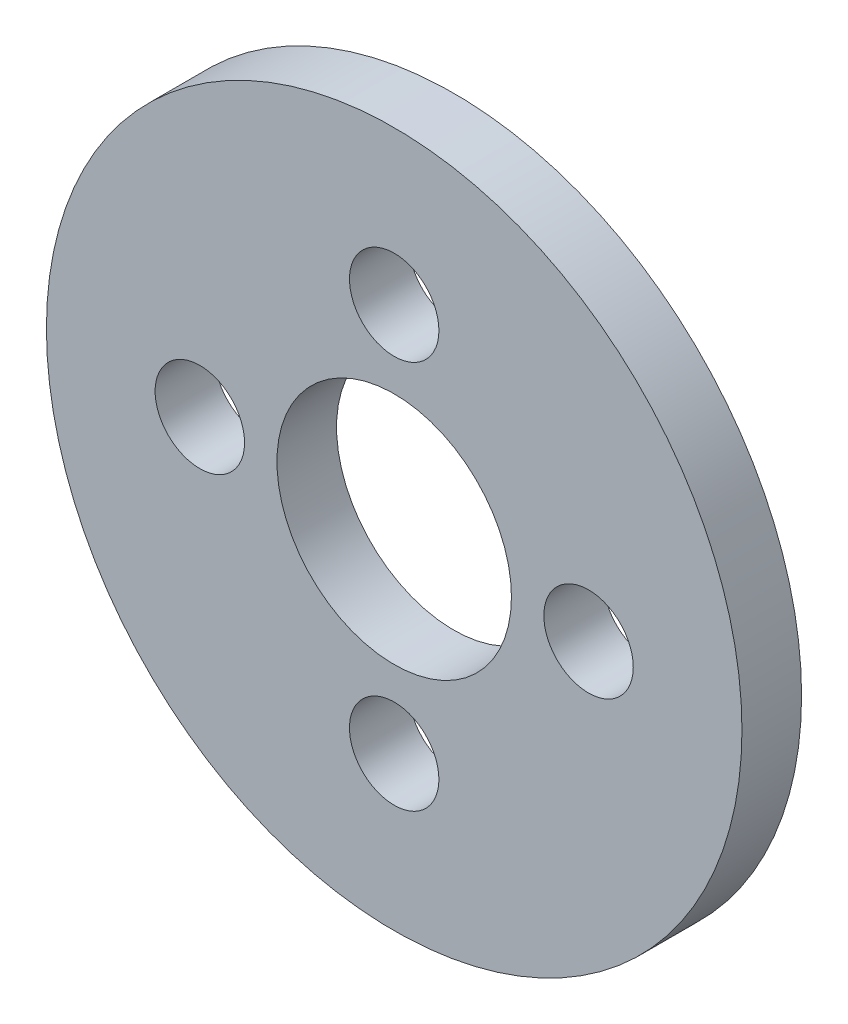
ISO-10303-21;
HEADER;
FILE_DESCRIPTION(('STEP AP214'),'2;1');
FILE_NAME('part.step','',(''),(''),'','','');
FILE_SCHEMA(('AUTOMOTIVE_DESIGN { 1 0 10303 214 1 1 1 1 }'));
ENDSEC;
DATA;
#1=APPLICATION_CONTEXT('core data for automotive mechanical design processes');
#2=APPLICATION_PROTOCOL_DEFINITION('international standard','automotive_design',2000,#1);
#3=PRODUCT_CONTEXT('',#1,'mechanical');
#4=PRODUCT('Part','Part','',(#3));
#5=PRODUCT_RELATED_PRODUCT_CATEGORY('part','',(#4));
#6=PRODUCT_DEFINITION_FORMATION('','',#4);
#7=PRODUCT_DEFINITION_CONTEXT('part definition',#1,'design');
#8=PRODUCT_DEFINITION('design','',#6,#7);
#9=PRODUCT_DEFINITION_SHAPE('','',#8);
#10=(LENGTH_UNIT() NAMED_UNIT(*) SI_UNIT(.MILLI.,.METRE.));
#11=(NAMED_UNIT(*) PLANE_ANGLE_UNIT() SI_UNIT($,.RADIAN.));
#12=(NAMED_UNIT(*) SI_UNIT($,.STERADIAN.) SOLID_ANGLE_UNIT());
#13=UNCERTAINTY_MEASURE_WITH_UNIT(LENGTH_MEASURE(1.E-05),#10,'distance_accuracy_value','');
#14=(GEOMETRIC_REPRESENTATION_CONTEXT(3) GLOBAL_UNCERTAINTY_ASSIGNED_CONTEXT((#13)) GLOBAL_UNIT_ASSIGNED_CONTEXT((#10,
#11,#12)) REPRESENTATION_CONTEXT('',''));
#15=CARTESIAN_POINT('',(0.,0.,0.));
#16=DIRECTION('',(0.,0.,1.));
#17=DIRECTION('',(1.,0.,0.));
#18=AXIS2_PLACEMENT_3D('',#15,#16,#17);
#19=CARTESIAN_POINT('',(0.,0.,3.));
#20=DIRECTION('',(0.,0.,-1.));
#21=DIRECTION('',(-1.,0.,0.));
#22=AXIS2_PLACEMENT_3D('',#19,#20,#21);
#23=CYLINDRICAL_SURFACE('',#22,5.9);
#24=CARTESIAN_POINT('',(0.,0.,3.));
#25=DIRECTION('',(0.,0.,1.));
#26=DIRECTION('',(1.,0.,0.));
#27=AXIS2_PLACEMENT_3D('',#24,#25,#26);
#28=CIRCLE('',#27,5.9);
#29=CARTESIAN_POINT('',(5.9,0.,3.));
#30=VERTEX_POINT('',#29);
#31=EDGE_CURVE('E41',#30,#30,#28,.T.);
#32=ORIENTED_EDGE('',*,*,#31,.T.);
#33=EDGE_LOOP('',(#32));
#34=FACE_BOUND('',#33,.T.);
#35=CARTESIAN_POINT('',(0.,0.,0.));
#36=DIRECTION('',(0.,0.,1.));
#37=DIRECTION('',(1.,0.,0.));
#38=AXIS2_PLACEMENT_3D('',#35,#36,#37);
#39=CIRCLE('',#38,5.9);
#40=CARTESIAN_POINT('',(5.9,0.,0.));
#41=VERTEX_POINT('',#40);
#42=EDGE_CURVE('E48',#41,#41,#39,.T.);
#43=ORIENTED_EDGE('',*,*,#42,.F.);
#44=EDGE_LOOP('',(#43));
#45=FACE_BOUND('',#44,.T.);
#46=ADVANCED_FACE('F34',(#34,#45),#23,.F.);
#47=CARTESIAN_POINT('',(0.,0.,3.));
#48=DIRECTION('',(0.,0.,-1.));
#49=DIRECTION('',(-1.,0.,0.));
#50=AXIS2_PLACEMENT_3D('',#47,#48,#49);
#51=CYLINDRICAL_SURFACE('',#50,17.5);
#52=CARTESIAN_POINT('',(0.,0.,3.));
#53=DIRECTION('',(0.,0.,1.));
#54=DIRECTION('',(1.,0.,0.));
#55=AXIS2_PLACEMENT_3D('',#52,#53,#54);
#56=CIRCLE('',#55,17.5);
#57=CARTESIAN_POINT('',(17.5,0.,3.));
#58=VERTEX_POINT('',#57);
#59=EDGE_CURVE('E10',#58,#58,#56,.T.);
#60=ORIENTED_EDGE('',*,*,#59,.F.);
#61=EDGE_LOOP('',(#60));
#62=FACE_BOUND('',#61,.T.);
#63=CARTESIAN_POINT('',(0.,0.,0.));
#64=DIRECTION('',(0.,0.,1.));
#65=DIRECTION('',(1.,0.,0.));
#66=AXIS2_PLACEMENT_3D('',#63,#64,#65);
#67=CIRCLE('',#66,17.5);
#68=CARTESIAN_POINT('',(17.5,0.,0.));
#69=VERTEX_POINT('',#68);
#70=EDGE_CURVE('E37',#69,#69,#67,.T.);
#71=ORIENTED_EDGE('',*,*,#70,.T.);
#72=EDGE_LOOP('',(#71));
#73=FACE_BOUND('',#72,.T.);
#74=ADVANCED_FACE('F93',(#62,#73),#51,.T.);
#75=CARTESIAN_POINT('',(0.,0.,3.));
#76=DIRECTION('',(0.,0.,1.));
#77=DIRECTION('',(1.,0.,0.));
#78=AXIS2_PLACEMENT_3D('',#75,#76,#77);
#79=PLANE('',#78);
#80=CARTESIAN_POINT('',(-9.78,1.01572700743669E-13,3.));
#81=DIRECTION('',(0.,0.,1.));
#82=DIRECTION('',(1.,0.,0.));
#83=AXIS2_PLACEMENT_3D('',#80,#81,#82);
#84=CIRCLE('',#83,2.25);
#85=CARTESIAN_POINT('',(-7.53,1.01572700743669E-13,3.));
#86=VERTEX_POINT('',#85);
#87=EDGE_CURVE('E74',#86,#86,#84,.T.);
#88=ORIENTED_EDGE('',*,*,#87,.F.);
#89=EDGE_LOOP('',(#88));
#90=FACE_BOUND('',#89,.T.);
#91=CARTESIAN_POINT('',(0.,9.78,3.));
#92=DIRECTION('',(0.,0.,1.));
#93=DIRECTION('',(1.,0.,0.));
#94=AXIS2_PLACEMENT_3D('',#91,#92,#93);
#95=CIRCLE('',#94,2.25);
#96=CARTESIAN_POINT('',(2.25,9.78,3.));
#97=VERTEX_POINT('',#96);
#98=EDGE_CURVE('E68',#97,#97,#95,.T.);
#99=ORIENTED_EDGE('',*,*,#98,.F.);
#100=EDGE_LOOP('',(#99));
#101=FACE_BOUND('',#100,.T.);
#102=CARTESIAN_POINT('',(9.78,-1.72604985859692E-13,3.));
#103=DIRECTION('',(0.,0.,1.));
#104=DIRECTION('',(1.,0.,0.));
#105=AXIS2_PLACEMENT_3D('',#102,#103,#104);
#106=CIRCLE('',#105,2.25);
#107=CARTESIAN_POINT('',(12.03,-1.72604985859692E-13,3.));
#108=VERTEX_POINT('',#107);
#109=EDGE_CURVE('E62',#108,#108,#106,.T.);
#110=ORIENTED_EDGE('',*,*,#109,.F.);
#111=EDGE_LOOP('',(#110));
#112=FACE_BOUND('',#111,.T.);
#113=CARTESIAN_POINT('',(0.,-9.78,3.));
#114=DIRECTION('',(0.,0.,1.));
#115=DIRECTION('',(1.,0.,0.));
#116=AXIS2_PLACEMENT_3D('',#113,#114,#115);
#117=CIRCLE('',#116,2.25);
#118=CARTESIAN_POINT('',(2.25,-9.78,3.));
#119=VERTEX_POINT('',#118);
#120=EDGE_CURVE('E55',#119,#119,#117,.T.);
#121=ORIENTED_EDGE('',*,*,#120,.F.);
#122=EDGE_LOOP('',(#121));
#123=FACE_BOUND('',#122,.T.);
#124=ORIENTED_EDGE('',*,*,#31,.F.);
#125=EDGE_LOOP('',(#124));
#126=FACE_BOUND('',#125,.T.);
#127=ORIENTED_EDGE('',*,*,#59,.T.);
#128=EDGE_LOOP('',(#127));
#129=FACE_BOUND('',#128,.T.);
#130=ADVANCED_FACE('F90',(#90,#101,#112,#123,#126,#129),#79,.T.);
#131=CARTESIAN_POINT('',(0.,0.,0.));
#132=DIRECTION('',(0.,0.,1.));
#133=DIRECTION('',(1.,0.,0.));
#134=AXIS2_PLACEMENT_3D('',#131,#132,#133);
#135=PLANE('',#134);
#136=CARTESIAN_POINT('',(-9.78,1.01572700743669E-13,0.));
#137=DIRECTION('',(0.,0.,1.));
#138=DIRECTION('',(1.,0.,0.));
#139=AXIS2_PLACEMENT_3D('',#136,#137,#138);
#140=CIRCLE('',#139,2.25);
#141=CARTESIAN_POINT('',(-7.53,1.01572700743669E-13,0.));
#142=VERTEX_POINT('',#141);
#143=EDGE_CURVE('E71',#142,#142,#140,.T.);
#144=ORIENTED_EDGE('',*,*,#143,.T.);
#145=EDGE_LOOP('',(#144));
#146=FACE_BOUND('',#145,.T.);
#147=CARTESIAN_POINT('',(0.,9.78,0.));
#148=DIRECTION('',(0.,0.,1.));
#149=DIRECTION('',(1.,0.,0.));
#150=AXIS2_PLACEMENT_3D('',#147,#148,#149);
#151=CIRCLE('',#150,2.25);
#152=CARTESIAN_POINT('',(2.25,9.78,0.));
#153=VERTEX_POINT('',#152);
#154=EDGE_CURVE('E65',#153,#153,#151,.T.);
#155=ORIENTED_EDGE('',*,*,#154,.T.);
#156=EDGE_LOOP('',(#155));
#157=FACE_BOUND('',#156,.T.);
#158=CARTESIAN_POINT('',(9.78,-1.72604985859692E-13,0.));
#159=DIRECTION('',(0.,0.,1.));
#160=DIRECTION('',(1.,0.,0.));
#161=AXIS2_PLACEMENT_3D('',#158,#159,#160);
#162=CIRCLE('',#161,2.25);
#163=CARTESIAN_POINT('',(12.03,-1.72604985859692E-13,0.));
#164=VERTEX_POINT('',#163);
#165=EDGE_CURVE('E60',#164,#164,#162,.T.);
#166=ORIENTED_EDGE('',*,*,#165,.T.);
#167=EDGE_LOOP('',(#166));
#168=FACE_BOUND('',#167,.T.);
#169=CARTESIAN_POINT('',(0.,-9.78,0.));
#170=DIRECTION('',(0.,0.,1.));
#171=DIRECTION('',(1.,0.,0.));
#172=AXIS2_PLACEMENT_3D('',#169,#170,#171);
#173=CIRCLE('',#172,2.25);
#174=CARTESIAN_POINT('',(2.25,-9.78,0.));
#175=VERTEX_POINT('',#174);
#176=EDGE_CURVE('E50',#175,#175,#173,.T.);
#177=ORIENTED_EDGE('',*,*,#176,.T.);
#178=EDGE_LOOP('',(#177));
#179=FACE_BOUND('',#178,.T.);
#180=ORIENTED_EDGE('',*,*,#42,.T.);
#181=EDGE_LOOP('',(#180));
#182=FACE_BOUND('',#181,.T.);
#183=ORIENTED_EDGE('',*,*,#70,.F.);
#184=EDGE_LOOP('',(#183));
#185=FACE_BOUND('',#184,.T.);
#186=ADVANCED_FACE('F80',(#146,#157,#168,#179,#182,#185),#135,.F.);
#187=CARTESIAN_POINT('',(0.,-9.78,0.));
#188=DIRECTION('',(0.,0.,1.));
#189=DIRECTION('',(1.,0.,0.));
#190=AXIS2_PLACEMENT_3D('',#187,#188,#189);
#191=CYLINDRICAL_SURFACE('',#190,2.25);
#192=ORIENTED_EDGE('',*,*,#176,.F.);
#193=EDGE_LOOP('',(#192));
#194=FACE_BOUND('',#193,.T.);
#195=ORIENTED_EDGE('',*,*,#120,.T.);
#196=EDGE_LOOP('',(#195));
#197=FACE_BOUND('',#196,.T.);
#198=ADVANCED_FACE('F114',(#194,#197),#191,.F.);
#199=CARTESIAN_POINT('',(9.78,-1.72604985859692E-13,0.));
#200=DIRECTION('',(0.,0.,1.));
#201=DIRECTION('',(1.,0.,0.));
#202=AXIS2_PLACEMENT_3D('',#199,#200,#201);
#203=CYLINDRICAL_SURFACE('',#202,2.25);
#204=ORIENTED_EDGE('',*,*,#165,.F.);
#205=EDGE_LOOP('',(#204));
#206=FACE_BOUND('',#205,.T.);
#207=ORIENTED_EDGE('',*,*,#109,.T.);
#208=EDGE_LOOP('',(#207));
#209=FACE_BOUND('',#208,.T.);
#210=ADVANCED_FACE('F118',(#206,#209),#203,.F.);
#211=CARTESIAN_POINT('',(0.,9.78,0.));
#212=DIRECTION('',(0.,0.,1.));
#213=DIRECTION('',(1.,0.,0.));
#214=AXIS2_PLACEMENT_3D('',#211,#212,#213);
#215=CYLINDRICAL_SURFACE('',#214,2.25);
#216=ORIENTED_EDGE('',*,*,#154,.F.);
#217=EDGE_LOOP('',(#216));
#218=FACE_BOUND('',#217,.T.);
#219=ORIENTED_EDGE('',*,*,#98,.T.);
#220=EDGE_LOOP('',(#219));
#221=FACE_BOUND('',#220,.T.);
#222=ADVANCED_FACE('F86',(#218,#221),#215,.F.);
#223=CARTESIAN_POINT('',(-9.78,1.01572700743669E-13,0.));
#224=DIRECTION('',(0.,0.,1.));
#225=DIRECTION('',(1.,0.,0.));
#226=AXIS2_PLACEMENT_3D('',#223,#224,#225);
#227=CYLINDRICAL_SURFACE('',#226,2.25);
#228=ORIENTED_EDGE('',*,*,#143,.F.);
#229=EDGE_LOOP('',(#228));
#230=FACE_BOUND('',#229,.T.);
#231=ORIENTED_EDGE('',*,*,#87,.T.);
#232=EDGE_LOOP('',(#231));
#233=FACE_BOUND('',#232,.T.);
#234=ADVANCED_FACE('F83',(#230,#233),#227,.F.);
#235=CLOSED_SHELL('',(#46,#74,#130,#186,#198,#210,#222,#234));
#236=MANIFOLD_SOLID_BREP('B2',#235);
#237=ADVANCED_BREP_SHAPE_REPRESENTATION('',(#18,#236),#14);
#238=SHAPE_DEFINITION_REPRESENTATION(#9,#237);
ENDSEC;
END-ISO-10303-21;
